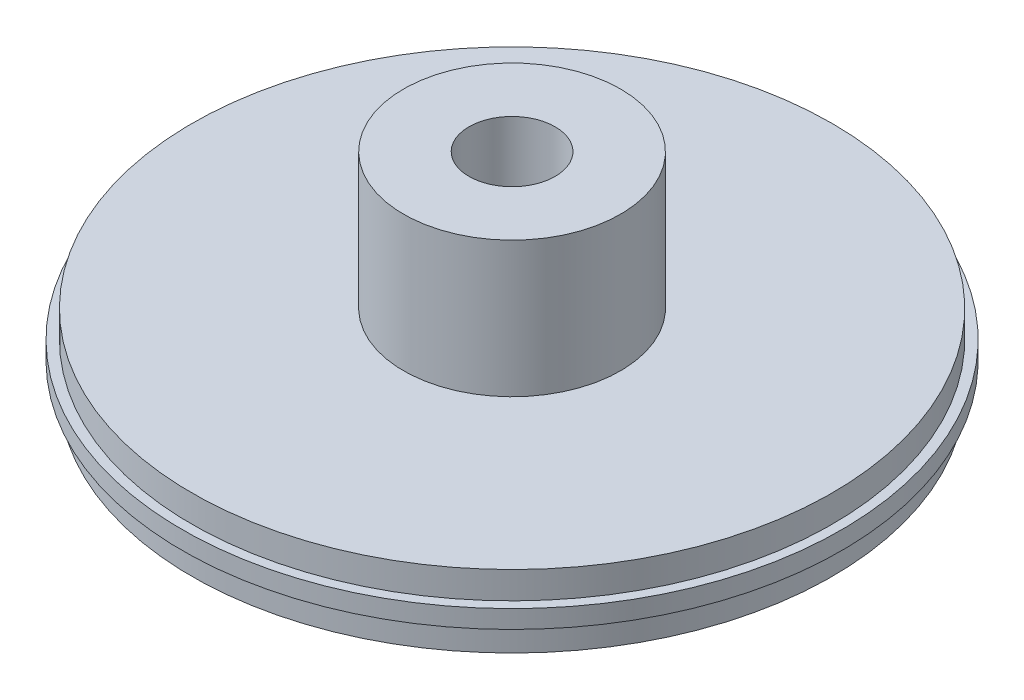
ISO-10303-21;
HEADER;
FILE_DESCRIPTION(('STEP AP214'),'2;1');
FILE_NAME('part.step','',(''),(''),'','','');
FILE_SCHEMA(('AUTOMOTIVE_DESIGN { 1 0 10303 214 1 1 1 1 }'));
ENDSEC;
DATA;
#1=APPLICATION_CONTEXT('core data for automotive mechanical design processes');
#2=APPLICATION_PROTOCOL_DEFINITION('international standard','automotive_design',2000,#1);
#3=PRODUCT_CONTEXT('',#1,'mechanical');
#4=PRODUCT('Part','Part','',(#3));
#5=PRODUCT_RELATED_PRODUCT_CATEGORY('part','',(#4));
#6=PRODUCT_DEFINITION_FORMATION('','',#4);
#7=PRODUCT_DEFINITION_CONTEXT('part definition',#1,'design');
#8=PRODUCT_DEFINITION('design','',#6,#7);
#9=PRODUCT_DEFINITION_SHAPE('','',#8);
#10=(LENGTH_UNIT() NAMED_UNIT(*) SI_UNIT(.MILLI.,.METRE.));
#11=(NAMED_UNIT(*) PLANE_ANGLE_UNIT() SI_UNIT($,.RADIAN.));
#12=(NAMED_UNIT(*) SI_UNIT($,.STERADIAN.) SOLID_ANGLE_UNIT());
#13=UNCERTAINTY_MEASURE_WITH_UNIT(LENGTH_MEASURE(1.E-05),#10,'distance_accuracy_value','');
#14=(GEOMETRIC_REPRESENTATION_CONTEXT(3) GLOBAL_UNCERTAINTY_ASSIGNED_CONTEXT((#13)) GLOBAL_UNIT_ASSIGNED_CONTEXT((#10,
#11,#12)) REPRESENTATION_CONTEXT('',''));
#15=CARTESIAN_POINT('',(0.,0.,0.));
#16=DIRECTION('',(0.,0.,1.));
#17=DIRECTION('',(1.,0.,0.));
#18=AXIS2_PLACEMENT_3D('',#15,#16,#17);
#19=CARTESIAN_POINT('',(0.,0.,0.));
#20=DIRECTION('',(0.,-1.,0.));
#21=DIRECTION('',(0.,0.,-1.));
#22=AXIS2_PLACEMENT_3D('',#19,#20,#21);
#23=CYLINDRICAL_SURFACE('',#22,17.7);
#24=CARTESIAN_POINT('',(0.,4.,0.));
#25=DIRECTION('',(0.,-1.,0.));
#26=DIRECTION('',(0.,0.,-1.));
#27=AXIS2_PLACEMENT_3D('',#24,#25,#26);
#28=CIRCLE('',#27,17.7);
#29=CARTESIAN_POINT('',(0.,4.,-17.7));
#30=VERTEX_POINT('',#29);
#31=EDGE_CURVE('E25',#30,#30,#28,.F.);
#32=ORIENTED_EDGE('',*,*,#31,.F.);
#33=EDGE_LOOP('',(#32));
#34=FACE_BOUND('',#33,.T.);
#35=CARTESIAN_POINT('',(0.,2.5,0.));
#36=DIRECTION('',(0.,-1.,0.));
#37=DIRECTION('',(0.,0.,-1.));
#38=AXIS2_PLACEMENT_3D('',#35,#36,#37);
#39=CIRCLE('',#38,17.7);
#40=CARTESIAN_POINT('',(0.,2.5,-17.7));
#41=VERTEX_POINT('',#40);
#42=EDGE_CURVE('E60',#41,#41,#39,.T.);
#43=ORIENTED_EDGE('',*,*,#42,.F.);
#44=EDGE_LOOP('',(#43));
#45=FACE_BOUND('',#44,.T.);
#46=ADVANCED_FACE('F22',(#34,#45),#23,.T.);
#47=CARTESIAN_POINT('',(0.,4.,-6.));
#48=DIRECTION('',(0.,1.,0.));
#49=DIRECTION('',(0.,0.,1.));
#50=AXIS2_PLACEMENT_3D('',#47,#48,#49);
#51=PLANE('',#50);
#52=ORIENTED_EDGE('',*,*,#31,.T.);
#53=EDGE_LOOP('',(#52));
#54=FACE_BOUND('',#53,.T.);
#55=CARTESIAN_POINT('',(0.,4.,0.));
#56=DIRECTION('',(0.,-1.,0.));
#57=DIRECTION('',(0.,0.,-1.));
#58=AXIS2_PLACEMENT_3D('',#55,#56,#57);
#59=CIRCLE('',#58,6.);
#60=CARTESIAN_POINT('',(0.,4.,-6.));
#61=VERTEX_POINT('',#60);
#62=EDGE_CURVE('E58',#61,#61,#59,.F.);
#63=ORIENTED_EDGE('',*,*,#62,.F.);
#64=EDGE_LOOP('',(#63));
#65=FACE_BOUND('',#64,.T.);
#66=ADVANCED_FACE('F69',(#54,#65),#51,.T.);
#67=CARTESIAN_POINT('',(0.,2.5,-17.7));
#68=DIRECTION('',(0.,1.,0.));
#69=DIRECTION('',(0.,0.,1.));
#70=AXIS2_PLACEMENT_3D('',#67,#68,#69);
#71=PLANE('',#70);
#72=CARTESIAN_POINT('',(0.,2.5,0.));
#73=DIRECTION('',(0.,-1.,0.));
#74=DIRECTION('',(0.,0.,-1.));
#75=AXIS2_PLACEMENT_3D('',#72,#73,#74);
#76=CIRCLE('',#75,18.2245);
#77=CARTESIAN_POINT('',(0.,2.5,-18.2245));
#78=VERTEX_POINT('',#77);
#79=EDGE_CURVE('E54',#78,#78,#76,.T.);
#80=ORIENTED_EDGE('',*,*,#79,.F.);
#81=EDGE_LOOP('',(#80));
#82=FACE_BOUND('',#81,.T.);
#83=ORIENTED_EDGE('',*,*,#42,.T.);
#84=EDGE_LOOP('',(#83));
#85=FACE_BOUND('',#84,.T.);
#86=ADVANCED_FACE('F78',(#82,#85),#71,.T.);
#87=CARTESIAN_POINT('',(0.,0.,0.));
#88=DIRECTION('',(0.,-1.,0.));
#89=DIRECTION('',(0.,0.,-1.));
#90=AXIS2_PLACEMENT_3D('',#87,#88,#89);
#91=CYLINDRICAL_SURFACE('',#90,6.);
#92=CARTESIAN_POINT('',(0.,11.5,0.));
#93=DIRECTION('',(0.,-1.,0.));
#94=DIRECTION('',(0.,0.,-1.));
#95=AXIS2_PLACEMENT_3D('',#92,#93,#94);
#96=CIRCLE('',#95,6.);
#97=CARTESIAN_POINT('',(0.,11.5,-6.));
#98=VERTEX_POINT('',#97);
#99=EDGE_CURVE('E51',#98,#98,#96,.F.);
#100=ORIENTED_EDGE('',*,*,#99,.F.);
#101=EDGE_LOOP('',(#100));
#102=FACE_BOUND('',#101,.T.);
#103=ORIENTED_EDGE('',*,*,#62,.T.);
#104=EDGE_LOOP('',(#103));
#105=FACE_BOUND('',#104,.T.);
#106=ADVANCED_FACE('F105',(#102,#105),#91,.T.);
#107=CARTESIAN_POINT('',(0.,0.,0.));
#108=DIRECTION('',(0.,-1.,0.));
#109=DIRECTION('',(0.,0.,-1.));
#110=AXIS2_PLACEMENT_3D('',#107,#108,#109);
#111=CYLINDRICAL_SURFACE('',#110,18.2245);
#112=ORIENTED_EDGE('',*,*,#79,.T.);
#113=EDGE_LOOP('',(#112));
#114=FACE_BOUND('',#113,.T.);
#115=CARTESIAN_POINT('',(0.,1.5,0.));
#116=DIRECTION('',(0.,-1.,0.));
#117=DIRECTION('',(0.,0.,-1.));
#118=AXIS2_PLACEMENT_3D('',#115,#116,#117);
#119=CIRCLE('',#118,18.2245);
#120=CARTESIAN_POINT('',(0.,1.5,-18.2245));
#121=VERTEX_POINT('',#120);
#122=EDGE_CURVE('E47',#121,#121,#119,.T.);
#123=ORIENTED_EDGE('',*,*,#122,.F.);
#124=EDGE_LOOP('',(#123));
#125=FACE_BOUND('',#124,.T.);
#126=ADVANCED_FACE('F101',(#114,#125),#111,.T.);
#127=CARTESIAN_POINT('',(0.,11.5,-2.));
#128=DIRECTION('',(0.,1.,0.));
#129=DIRECTION('',(0.,0.,1.));
#130=AXIS2_PLACEMENT_3D('',#127,#128,#129);
#131=PLANE('',#130);
#132=ORIENTED_EDGE('',*,*,#99,.T.);
#133=EDGE_LOOP('',(#132));
#134=FACE_BOUND('',#133,.T.);
#135=CARTESIAN_POINT('',(0.,11.5,0.));
#136=DIRECTION('',(0.,-1.,0.));
#137=DIRECTION('',(0.,0.,-1.));
#138=AXIS2_PLACEMENT_3D('',#135,#136,#137);
#139=CIRCLE('',#138,2.38125);
#140=CARTESIAN_POINT('',(0.,11.5,-2.38125));
#141=VERTEX_POINT('',#140);
#142=EDGE_CURVE('E44',#141,#141,#139,.T.);
#143=ORIENTED_EDGE('',*,*,#142,.T.);
#144=EDGE_LOOP('',(#143));
#145=FACE_BOUND('',#144,.T.);
#146=ADVANCED_FACE('F97',(#134,#145),#131,.T.);
#147=CARTESIAN_POINT('',(0.,1.5,-18.2245));
#148=DIRECTION('',(0.,-1.,0.));
#149=DIRECTION('',(0.,0.,-1.));
#150=AXIS2_PLACEMENT_3D('',#147,#148,#149);
#151=PLANE('',#150);
#152=CARTESIAN_POINT('',(0.,1.5,0.));
#153=DIRECTION('',(0.,-1.,0.));
#154=DIRECTION('',(0.,0.,-1.));
#155=AXIS2_PLACEMENT_3D('',#152,#153,#154);
#156=CIRCLE('',#155,17.7);
#157=CARTESIAN_POINT('',(0.,1.5,-17.7));
#158=VERTEX_POINT('',#157);
#159=EDGE_CURVE('E39',#158,#158,#156,.T.);
#160=ORIENTED_EDGE('',*,*,#159,.F.);
#161=EDGE_LOOP('',(#160));
#162=FACE_BOUND('',#161,.T.);
#163=ORIENTED_EDGE('',*,*,#122,.T.);
#164=EDGE_LOOP('',(#163));
#165=FACE_BOUND('',#164,.T.);
#166=ADVANCED_FACE('F93',(#162,#165),#151,.T.);
#167=CARTESIAN_POINT('',(0.,18.2351920908019,0.));
#168=DIRECTION('',(0.,-1.,0.));
#169=DIRECTION('',(0.,0.,-1.));
#170=AXIS2_PLACEMENT_3D('',#167,#168,#169);
#171=CYLINDRICAL_SURFACE('',#170,2.38125);
#172=CARTESIAN_POINT('',(0.,0.,0.));
#173=DIRECTION('',(0.,-1.,0.));
#174=DIRECTION('',(0.,0.,-1.));
#175=AXIS2_PLACEMENT_3D('',#172,#173,#174);
#176=CIRCLE('',#175,2.38125);
#177=CARTESIAN_POINT('',(0.,0.,-2.38125));
#178=VERTEX_POINT('',#177);
#179=EDGE_CURVE('E30',#178,#178,#176,.F.);
#180=ORIENTED_EDGE('',*,*,#179,.F.);
#181=EDGE_LOOP('',(#180));
#182=FACE_BOUND('',#181,.T.);
#183=ORIENTED_EDGE('',*,*,#142,.F.);
#184=EDGE_LOOP('',(#183));
#185=FACE_BOUND('',#184,.T.);
#186=ADVANCED_FACE('F86',(#182,#185),#171,.F.);
#187=CARTESIAN_POINT('',(0.,0.,0.));
#188=DIRECTION('',(0.,-1.,0.));
#189=DIRECTION('',(0.,0.,-1.));
#190=AXIS2_PLACEMENT_3D('',#187,#188,#189);
#191=CYLINDRICAL_SURFACE('',#190,17.7);
#192=ORIENTED_EDGE('',*,*,#159,.T.);
#193=EDGE_LOOP('',(#192));
#194=FACE_BOUND('',#193,.T.);
#195=CARTESIAN_POINT('',(0.,0.,0.));
#196=DIRECTION('',(0.,-1.,0.));
#197=DIRECTION('',(0.,0.,-1.));
#198=AXIS2_PLACEMENT_3D('',#195,#196,#197);
#199=CIRCLE('',#198,17.7);
#200=CARTESIAN_POINT('',(0.,0.,-17.7));
#201=VERTEX_POINT('',#200);
#202=EDGE_CURVE('E12',#201,#201,#199,.T.);
#203=ORIENTED_EDGE('',*,*,#202,.F.);
#204=EDGE_LOOP('',(#203));
#205=FACE_BOUND('',#204,.T.);
#206=ADVANCED_FACE('F81',(#194,#205),#191,.T.);
#207=CARTESIAN_POINT('',(0.,0.,-17.7));
#208=DIRECTION('',(0.,-1.,0.));
#209=DIRECTION('',(0.,0.,-1.));
#210=AXIS2_PLACEMENT_3D('',#207,#208,#209);
#211=PLANE('',#210);
#212=ORIENTED_EDGE('',*,*,#202,.T.);
#213=EDGE_LOOP('',(#212));
#214=FACE_BOUND('',#213,.T.);
#215=ORIENTED_EDGE('',*,*,#179,.T.);
#216=EDGE_LOOP('',(#215));
#217=FACE_BOUND('',#216,.T.);
#218=ADVANCED_FACE('F79',(#214,#217),#211,.T.);
#219=CLOSED_SHELL('',(#46,#66,#86,#106,#126,#146,#166,#186,#206,#218));
#220=MANIFOLD_SOLID_BREP('B1',#219);
#221=ADVANCED_BREP_SHAPE_REPRESENTATION('',(#18,#220),#14);
#222=SHAPE_DEFINITION_REPRESENTATION(#9,#221);
ENDSEC;
END-ISO-10303-21;
